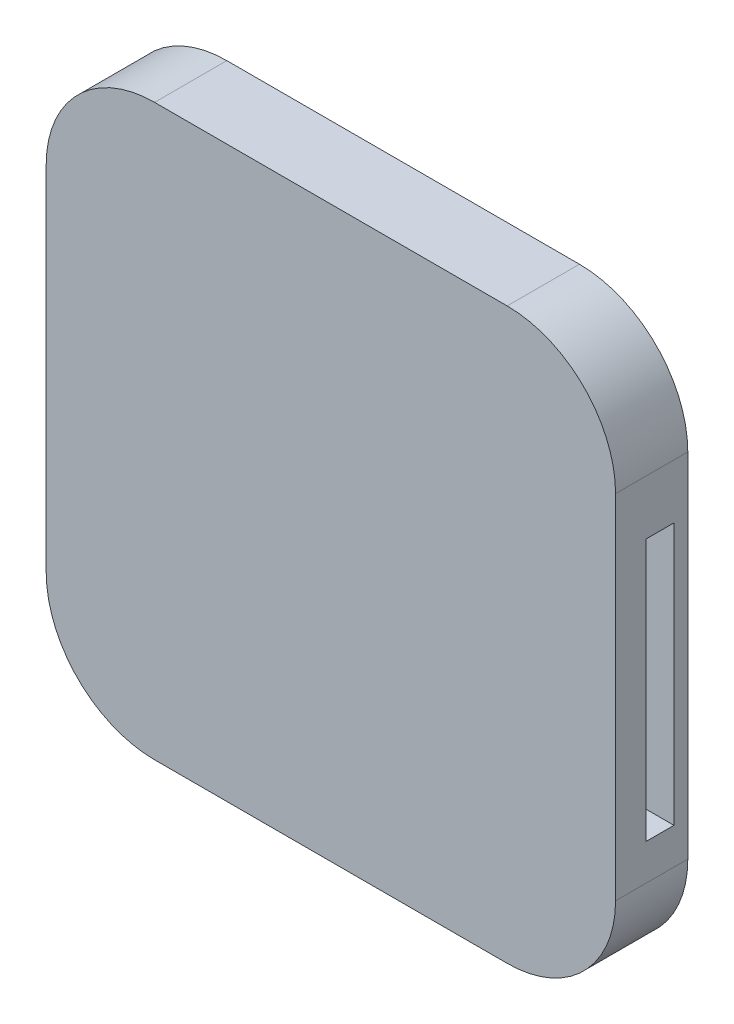
ISO-10303-21;
HEADER;
FILE_DESCRIPTION(('STEP AP214'),'2;1');
FILE_NAME('part.step','',(''),(''),'','','');
FILE_SCHEMA(('AUTOMOTIVE_DESIGN { 1 0 10303 214 1 1 1 1 }'));
ENDSEC;
DATA;
#1=APPLICATION_CONTEXT('core data for automotive mechanical design processes');
#2=APPLICATION_PROTOCOL_DEFINITION('international standard','automotive_design',2000,#1);
#3=PRODUCT_CONTEXT('',#1,'mechanical');
#4=PRODUCT('Part','Part','',(#3));
#5=PRODUCT_RELATED_PRODUCT_CATEGORY('part','',(#4));
#6=PRODUCT_DEFINITION_FORMATION('','',#4);
#7=PRODUCT_DEFINITION_CONTEXT('part definition',#1,'design');
#8=PRODUCT_DEFINITION('design','',#6,#7);
#9=PRODUCT_DEFINITION_SHAPE('','',#8);
#10=(LENGTH_UNIT() NAMED_UNIT(*) SI_UNIT(.MILLI.,.METRE.));
#11=(NAMED_UNIT(*) PLANE_ANGLE_UNIT() SI_UNIT($,.RADIAN.));
#12=(NAMED_UNIT(*) SI_UNIT($,.STERADIAN.) SOLID_ANGLE_UNIT());
#13=UNCERTAINTY_MEASURE_WITH_UNIT(LENGTH_MEASURE(1.E-05),#10,'distance_accuracy_value','');
#14=(GEOMETRIC_REPRESENTATION_CONTEXT(3) GLOBAL_UNCERTAINTY_ASSIGNED_CONTEXT((#13)) GLOBAL_UNIT_ASSIGNED_CONTEXT((#10,
#11,#12)) REPRESENTATION_CONTEXT('',''));
#15=CARTESIAN_POINT('',(0.,0.,0.));
#16=DIRECTION('',(0.,0.,1.));
#17=DIRECTION('',(1.,0.,0.));
#18=AXIS2_PLACEMENT_3D('',#15,#16,#17);
#19=CARTESIAN_POINT('',(-29.1727335907336,34.1958532818533,12.7));
#20=DIRECTION('',(1.,0.,0.));
#21=DIRECTION('',(0.,1.,0.));
#22=AXIS2_PLACEMENT_3D('',#19,#20,#21);
#23=PLANE('',#22);
#24=DIRECTION('',(0.,-1.,0.));
#25=VECTOR('',#24,1.);
#26=CARTESIAN_POINT('',(-29.1727335907336,34.1958532818533,0.));
#27=LINE('',#26,#25);
#28=CARTESIAN_POINT('',(-29.1727335907336,15.1458532818533,0.));
#29=VERTEX_POINT('',#28);
#30=CARTESIAN_POINT('',(-29.1727335907336,-46.8301467181467,0.));
#31=VERTEX_POINT('',#30);
#32=EDGE_CURVE('E158',#29,#31,#27,.T.);
#33=ORIENTED_EDGE('',*,*,#32,.T.);
#34=DIRECTION('',(0.,0.,-1.));
#35=VECTOR('',#34,1.);
#36=CARTESIAN_POINT('',(-29.1727335907336,-46.8301467181467,12.7));
#37=LINE('',#36,#35);
#38=CARTESIAN_POINT('',(-29.1727335907336,-46.8301467181467,12.7));
#39=VERTEX_POINT('',#38);
#40=EDGE_CURVE('E212',#31,#39,#37,.F.);
#41=ORIENTED_EDGE('',*,*,#40,.T.);
#42=DIRECTION('',(0.,-1.,0.));
#43=VECTOR('',#42,1.);
#44=CARTESIAN_POINT('',(-29.1727335907336,34.1958532818533,12.7));
#45=LINE('',#44,#43);
#46=CARTESIAN_POINT('',(-29.1727335907336,15.1458532818533,12.7));
#47=VERTEX_POINT('',#46);
#48=EDGE_CURVE('E162',#47,#39,#45,.T.);
#49=ORIENTED_EDGE('',*,*,#48,.F.);
#50=DIRECTION('',(0.,0.,-1.));
#51=VECTOR('',#50,1.);
#52=CARTESIAN_POINT('',(-29.1727335907336,15.1458532818533,12.7));
#53=LINE('',#52,#51);
#54=EDGE_CURVE('E209',#47,#29,#53,.T.);
#55=ORIENTED_EDGE('',*,*,#54,.T.);
#56=EDGE_LOOP('',(#33,#41,#49,#55));
#57=FACE_BOUND('',#56,.T.);
#58=ADVANCED_FACE('F33',(#57),#23,.F.);
#59=CARTESIAN_POINT('',(-29.1727335907336,-65.8801467181467,12.7));
#60=DIRECTION('',(0.,1.,0.));
#61=DIRECTION('',(0.,0.,1.));
#62=AXIS2_PLACEMENT_3D('',#59,#60,#61);
#63=PLANE('',#62);
#64=DIRECTION('',(1.,0.,0.));
#65=VECTOR('',#64,1.);
#66=CARTESIAN_POINT('',(-29.1727335907336,-65.8801467181467,0.));
#67=LINE('',#66,#65);
#68=CARTESIAN_POINT('',(-10.1227335907336,-65.8801467181467,0.));
#69=VERTEX_POINT('',#68);
#70=CARTESIAN_POINT('',(51.8532664092664,-65.8801467181467,0.));
#71=VERTEX_POINT('',#70);
#72=EDGE_CURVE('E177',#69,#71,#67,.T.);
#73=ORIENTED_EDGE('',*,*,#72,.T.);
#74=DIRECTION('',(0.,0.,-1.));
#75=VECTOR('',#74,1.);
#76=CARTESIAN_POINT('',(51.8532664092664,-65.8801467181467,12.7));
#77=LINE('',#76,#75);
#78=CARTESIAN_POINT('',(51.8532664092664,-65.8801467181467,12.7));
#79=VERTEX_POINT('',#78);
#80=EDGE_CURVE('E199',#71,#79,#77,.F.);
#81=ORIENTED_EDGE('',*,*,#80,.T.);
#82=DIRECTION('',(1.,0.,0.));
#83=VECTOR('',#82,1.);
#84=CARTESIAN_POINT('',(-29.1727335907336,-65.8801467181467,12.7));
#85=LINE('',#84,#83);
#86=CARTESIAN_POINT('',(-10.1227335907336,-65.8801467181467,12.7));
#87=VERTEX_POINT('',#86);
#88=EDGE_CURVE('E165',#87,#79,#85,.T.);
#89=ORIENTED_EDGE('',*,*,#88,.F.);
#90=DIRECTION('',(0.,0.,-1.));
#91=VECTOR('',#90,1.);
#92=CARTESIAN_POINT('',(-10.1227335907336,-65.8801467181467,12.7));
#93=LINE('',#92,#91);
#94=EDGE_CURVE('E196',#87,#69,#93,.T.);
#95=ORIENTED_EDGE('',*,*,#94,.T.);
#96=EDGE_LOOP('',(#73,#81,#89,#95));
#97=FACE_BOUND('',#96,.T.);
#98=ADVANCED_FACE('F228',(#97),#63,.F.);
#99=CARTESIAN_POINT('',(70.9032664092664,34.1958532818533,12.7));
#100=DIRECTION('',(-1.,0.,0.));
#101=DIRECTION('',(0.,0.,1.));
#102=AXIS2_PLACEMENT_3D('',#99,#100,#101);
#103=PLANE('',#102);
#104=DIRECTION('',(0.,0.,-1.));
#105=VECTOR('',#104,1.);
#106=CARTESIAN_POINT('',(70.9032664092664,-40.4756229609282,7.3811634504968));
#107=LINE('',#106,#105);
#108=CARTESIAN_POINT('',(70.9032664092664,-40.4756229609282,7.3811634504968));
#109=VERTEX_POINT('',#108);
#110=CARTESIAN_POINT('',(70.9032664092664,-40.4756229609282,2.43295424888998));
#111=VERTEX_POINT('',#110);
#112=EDGE_CURVE('E152',#109,#111,#107,.T.);
#113=ORIENTED_EDGE('',*,*,#112,.F.);
#114=DIRECTION('',(0.,-1.,0.));
#115=VECTOR('',#114,1.);
#116=CARTESIAN_POINT('',(70.9032664092664,5.56423656706574,7.3811634504968));
#117=LINE('',#116,#115);
#118=CARTESIAN_POINT('',(70.9032664092664,5.56423656706574,7.3811634504968));
#119=VERTEX_POINT('',#118);
#120=EDGE_CURVE('E48',#119,#109,#117,.T.);
#121=ORIENTED_EDGE('',*,*,#120,.F.);
#122=DIRECTION('',(0.,0.,1.));
#123=VECTOR('',#122,1.);
#124=CARTESIAN_POINT('',(70.9032664092664,5.56423656706574,7.3811634504968));
#125=LINE('',#124,#123);
#126=CARTESIAN_POINT('',(70.9032664092664,5.56423656706574,2.43295424888998));
#127=VERTEX_POINT('',#126);
#128=EDGE_CURVE('E143',#127,#119,#125,.T.);
#129=ORIENTED_EDGE('',*,*,#128,.F.);
#130=DIRECTION('',(0.,1.,0.));
#131=VECTOR('',#130,1.);
#132=CARTESIAN_POINT('',(70.9032664092664,5.56423656706574,2.43295424888998));
#133=LINE('',#132,#131);
#134=EDGE_CURVE('E146',#111,#127,#133,.T.);
#135=ORIENTED_EDGE('',*,*,#134,.F.);
#136=EDGE_LOOP('',(#113,#121,#129,#135));
#137=FACE_BOUND('',#136,.T.);
#138=DIRECTION('',(0.,1.,0.));
#139=VECTOR('',#138,1.);
#140=CARTESIAN_POINT('',(70.9032664092664,34.1958532818533,12.7));
#141=LINE('',#140,#139);
#142=CARTESIAN_POINT('',(70.9032664092664,-46.8301467181467,12.7));
#143=VERTEX_POINT('',#142);
#144=CARTESIAN_POINT('',(70.9032664092664,15.1458532818533,12.7));
#145=VERTEX_POINT('',#144);
#146=EDGE_CURVE('E169',#143,#145,#141,.T.);
#147=ORIENTED_EDGE('',*,*,#146,.F.);
#148=DIRECTION('',(0.,0.,-1.));
#149=VECTOR('',#148,1.);
#150=CARTESIAN_POINT('',(70.9032664092664,-46.8301467181467,12.7));
#151=LINE('',#150,#149);
#152=CARTESIAN_POINT('',(70.9032664092664,-46.8301467181467,0.));
#153=VERTEX_POINT('',#152);
#154=EDGE_CURVE('E185',#143,#153,#151,.T.);
#155=ORIENTED_EDGE('',*,*,#154,.T.);
#156=DIRECTION('',(0.,1.,0.));
#157=VECTOR('',#156,1.);
#158=CARTESIAN_POINT('',(70.9032664092664,34.1958532818533,0.));
#159=LINE('',#158,#157);
#160=CARTESIAN_POINT('',(70.9032664092664,15.1458532818533,0.));
#161=VERTEX_POINT('',#160);
#162=EDGE_CURVE('E180',#153,#161,#159,.T.);
#163=ORIENTED_EDGE('',*,*,#162,.T.);
#164=DIRECTION('',(0.,0.,-1.));
#165=VECTOR('',#164,1.);
#166=CARTESIAN_POINT('',(70.9032664092664,15.1458532818533,12.7));
#167=LINE('',#166,#165);
#168=EDGE_CURVE('E174',#161,#145,#167,.F.);
#169=ORIENTED_EDGE('',*,*,#168,.T.);
#170=EDGE_LOOP('',(#147,#155,#163,#169));
#171=FACE_BOUND('',#170,.T.);
#172=ADVANCED_FACE('F239',(#137,#171),#103,.F.);
#173=CARTESIAN_POINT('',(-29.1727335907336,34.1958532818533,12.7));
#174=DIRECTION('',(0.,-1.,0.));
#175=DIRECTION('',(0.,0.,-1.));
#176=AXIS2_PLACEMENT_3D('',#173,#174,#175);
#177=PLANE('',#176);
#178=DIRECTION('',(-1.,0.,0.));
#179=VECTOR('',#178,1.);
#180=CARTESIAN_POINT('',(-29.1727335907336,34.1958532818533,12.7));
#181=LINE('',#180,#179);
#182=CARTESIAN_POINT('',(51.8532664092664,34.1958532818533,12.7));
#183=VERTEX_POINT('',#182);
#184=CARTESIAN_POINT('',(-10.1227335907336,34.1958532818533,12.7));
#185=VERTEX_POINT('',#184);
#186=EDGE_CURVE('E172',#183,#185,#181,.T.);
#187=ORIENTED_EDGE('',*,*,#186,.F.);
#188=DIRECTION('',(0.,0.,-1.));
#189=VECTOR('',#188,1.);
#190=CARTESIAN_POINT('',(51.8532664092664,34.1958532818533,12.7));
#191=LINE('',#190,#189);
#192=CARTESIAN_POINT('',(51.8532664092664,34.1958532818533,0.));
#193=VERTEX_POINT('',#192);
#194=EDGE_CURVE('E11',#183,#193,#191,.T.);
#195=ORIENTED_EDGE('',*,*,#194,.T.);
#196=DIRECTION('',(-1.,0.,0.));
#197=VECTOR('',#196,1.);
#198=CARTESIAN_POINT('',(-29.1727335907336,34.1958532818533,0.));
#199=LINE('',#198,#197);
#200=CARTESIAN_POINT('',(-10.1227335907336,34.1958532818533,0.));
#201=VERTEX_POINT('',#200);
#202=EDGE_CURVE('E166',#193,#201,#199,.T.);
#203=ORIENTED_EDGE('',*,*,#202,.T.);
#204=DIRECTION('',(0.,0.,-1.));
#205=VECTOR('',#204,1.);
#206=CARTESIAN_POINT('',(-10.1227335907336,34.1958532818533,12.7));
#207=LINE('',#206,#205);
#208=EDGE_CURVE('E41',#201,#185,#207,.F.);
#209=ORIENTED_EDGE('',*,*,#208,.T.);
#210=EDGE_LOOP('',(#187,#195,#203,#209));
#211=FACE_BOUND('',#210,.T.);
#212=ADVANCED_FACE('F246',(#211),#177,.F.);
#213=CARTESIAN_POINT('',(0.,0.,12.7));
#214=DIRECTION('',(0.,0.,1.));
#215=DIRECTION('',(1.,0.,0.));
#216=AXIS2_PLACEMENT_3D('',#213,#214,#215);
#217=PLANE('',#216);
#218=ORIENTED_EDGE('',*,*,#88,.T.);
#219=CARTESIAN_POINT('',(51.8532664092664,-46.8301467181467,12.7));
#220=DIRECTION('',(0.,0.,1.));
#221=DIRECTION('',(1.,0.,0.));
#222=AXIS2_PLACEMENT_3D('',#219,#220,#221);
#223=CIRCLE('',#222,19.05);
#224=EDGE_CURVE('E207',#79,#143,#223,.T.);
#225=ORIENTED_EDGE('',*,*,#224,.T.);
#226=ORIENTED_EDGE('',*,*,#146,.T.);
#227=CARTESIAN_POINT('',(51.8532664092664,15.1458532818533,12.7));
#228=DIRECTION('',(0.,0.,1.));
#229=DIRECTION('',(1.,0.,0.));
#230=AXIS2_PLACEMENT_3D('',#227,#228,#229);
#231=CIRCLE('',#230,19.05);
#232=EDGE_CURVE('E203',#145,#183,#231,.T.);
#233=ORIENTED_EDGE('',*,*,#232,.T.);
#234=ORIENTED_EDGE('',*,*,#186,.T.);
#235=CARTESIAN_POINT('',(-10.1227335907336,15.1458532818533,12.7));
#236=DIRECTION('',(0.,0.,1.));
#237=DIRECTION('',(1.,0.,0.));
#238=AXIS2_PLACEMENT_3D('',#235,#236,#237);
#239=CIRCLE('',#238,19.05);
#240=EDGE_CURVE('E201',#185,#47,#239,.T.);
#241=ORIENTED_EDGE('',*,*,#240,.T.);
#242=ORIENTED_EDGE('',*,*,#48,.T.);
#243=CARTESIAN_POINT('',(-10.1227335907336,-46.8301467181467,12.7));
#244=DIRECTION('',(0.,0.,1.));
#245=DIRECTION('',(1.,0.,0.));
#246=AXIS2_PLACEMENT_3D('',#243,#244,#245);
#247=CIRCLE('',#246,19.05);
#248=EDGE_CURVE('E205',#39,#87,#247,.T.);
#249=ORIENTED_EDGE('',*,*,#248,.T.);
#250=EDGE_LOOP('',(#218,#225,#226,#233,#234,#241,#242,#249));
#251=FACE_BOUND('',#250,.T.);
#252=ADVANCED_FACE('F221',(#251),#217,.T.);
#253=CARTESIAN_POINT('',(0.,0.,0.));
#254=DIRECTION('',(0.,0.,1.));
#255=DIRECTION('',(1.,0.,0.));
#256=AXIS2_PLACEMENT_3D('',#253,#254,#255);
#257=PLANE('',#256);
#258=ORIENTED_EDGE('',*,*,#162,.F.);
#259=CARTESIAN_POINT('',(51.8532664092664,-46.8301467181467,0.));
#260=DIRECTION('',(0.,0.,1.));
#261=DIRECTION('',(1.,0.,0.));
#262=AXIS2_PLACEMENT_3D('',#259,#260,#261);
#263=CIRCLE('',#262,19.05);
#264=EDGE_CURVE('E194',#153,#71,#263,.F.);
#265=ORIENTED_EDGE('',*,*,#264,.T.);
#266=ORIENTED_EDGE('',*,*,#72,.F.);
#267=CARTESIAN_POINT('',(-10.1227335907336,-46.8301467181467,0.));
#268=DIRECTION('',(0.,0.,1.));
#269=DIRECTION('',(1.,0.,0.));
#270=AXIS2_PLACEMENT_3D('',#267,#268,#269);
#271=CIRCLE('',#270,19.05);
#272=EDGE_CURVE('E192',#69,#31,#271,.F.);
#273=ORIENTED_EDGE('',*,*,#272,.T.);
#274=ORIENTED_EDGE('',*,*,#32,.F.);
#275=CARTESIAN_POINT('',(-10.1227335907336,15.1458532818533,0.));
#276=DIRECTION('',(0.,0.,1.));
#277=DIRECTION('',(1.,0.,0.));
#278=AXIS2_PLACEMENT_3D('',#275,#276,#277);
#279=CIRCLE('',#278,19.05);
#280=EDGE_CURVE('E188',#29,#201,#279,.F.);
#281=ORIENTED_EDGE('',*,*,#280,.T.);
#282=ORIENTED_EDGE('',*,*,#202,.F.);
#283=CARTESIAN_POINT('',(51.8532664092664,15.1458532818533,0.));
#284=DIRECTION('',(0.,0.,1.));
#285=DIRECTION('',(1.,0.,0.));
#286=AXIS2_PLACEMENT_3D('',#283,#284,#285);
#287=CIRCLE('',#286,19.05);
#288=EDGE_CURVE('E190',#193,#161,#287,.F.);
#289=ORIENTED_EDGE('',*,*,#288,.T.);
#290=EDGE_LOOP('',(#258,#265,#266,#273,#274,#281,#282,#289));
#291=FACE_BOUND('',#290,.T.);
#292=ADVANCED_FACE('F232',(#291),#257,.F.);
#293=CARTESIAN_POINT('',(51.8532664092664,-46.8301467181467,12.7));
#294=DIRECTION('',(0.,0.,-1.));
#295=DIRECTION('',(-1.,0.,0.));
#296=AXIS2_PLACEMENT_3D('',#293,#294,#295);
#297=CYLINDRICAL_SURFACE('',#296,19.05);
#298=ORIENTED_EDGE('',*,*,#224,.F.);
#299=ORIENTED_EDGE('',*,*,#80,.F.);
#300=ORIENTED_EDGE('',*,*,#264,.F.);
#301=ORIENTED_EDGE('',*,*,#154,.F.);
#302=EDGE_LOOP('',(#298,#299,#300,#301));
#303=FACE_BOUND('',#302,.T.);
#304=ADVANCED_FACE('F236',(#303),#297,.T.);
#305=CARTESIAN_POINT('',(-10.1227335907336,-46.8301467181467,12.7));
#306=DIRECTION('',(0.,0.,-1.));
#307=DIRECTION('',(-1.,0.,0.));
#308=AXIS2_PLACEMENT_3D('',#305,#306,#307);
#309=CYLINDRICAL_SURFACE('',#308,19.05);
#310=ORIENTED_EDGE('',*,*,#248,.F.);
#311=ORIENTED_EDGE('',*,*,#40,.F.);
#312=ORIENTED_EDGE('',*,*,#272,.F.);
#313=ORIENTED_EDGE('',*,*,#94,.F.);
#314=EDGE_LOOP('',(#310,#311,#312,#313));
#315=FACE_BOUND('',#314,.T.);
#316=ADVANCED_FACE('F225',(#315),#309,.T.);
#317=CARTESIAN_POINT('',(51.8532664092664,15.1458532818533,12.7));
#318=DIRECTION('',(0.,0.,-1.));
#319=DIRECTION('',(-1.,0.,0.));
#320=AXIS2_PLACEMENT_3D('',#317,#318,#319);
#321=CYLINDRICAL_SURFACE('',#320,19.05);
#322=ORIENTED_EDGE('',*,*,#232,.F.);
#323=ORIENTED_EDGE('',*,*,#168,.F.);
#324=ORIENTED_EDGE('',*,*,#288,.F.);
#325=ORIENTED_EDGE('',*,*,#194,.F.);
#326=EDGE_LOOP('',(#322,#323,#324,#325));
#327=FACE_BOUND('',#326,.T.);
#328=ADVANCED_FACE('F244',(#327),#321,.T.);
#329=CARTESIAN_POINT('',(-10.1227335907336,15.1458532818533,12.7));
#330=DIRECTION('',(0.,0.,-1.));
#331=DIRECTION('',(-1.,0.,0.));
#332=AXIS2_PLACEMENT_3D('',#329,#330,#331);
#333=CYLINDRICAL_SURFACE('',#332,19.05);
#334=ORIENTED_EDGE('',*,*,#240,.F.);
#335=ORIENTED_EDGE('',*,*,#208,.F.);
#336=ORIENTED_EDGE('',*,*,#280,.F.);
#337=ORIENTED_EDGE('',*,*,#54,.F.);
#338=EDGE_LOOP('',(#334,#335,#336,#337));
#339=FACE_BOUND('',#338,.T.);
#340=ADVANCED_FACE('F35',(#339),#333,.T.);
#341=CARTESIAN_POINT('',(60.9972664092664,5.56423656706574,7.3811634504968));
#342=DIRECTION('',(0.,0.,1.));
#343=DIRECTION('',(1.,0.,0.));
#344=AXIS2_PLACEMENT_3D('',#341,#342,#343);
#345=PLANE('',#344);
#346=ORIENTED_EDGE('',*,*,#120,.T.);
#347=DIRECTION('',(1.,0.,0.));
#348=VECTOR('',#347,1.);
#349=CARTESIAN_POINT('',(60.9972664092664,-40.4756229609282,7.3811634504968));
#350=LINE('',#349,#348);
#351=CARTESIAN_POINT('',(60.9972664092664,-40.4756229609282,7.3811634504968));
#352=VERTEX_POINT('',#351);
#353=EDGE_CURVE('E121',#352,#109,#350,.T.);
#354=ORIENTED_EDGE('',*,*,#353,.F.);
#355=DIRECTION('',(0.,-1.,0.));
#356=VECTOR('',#355,1.);
#357=CARTESIAN_POINT('',(60.9972664092664,5.56423656706574,7.3811634504968));
#358=LINE('',#357,#356);
#359=CARTESIAN_POINT('',(60.9972664092664,5.56423656706574,7.3811634504968));
#360=VERTEX_POINT('',#359);
#361=EDGE_CURVE('E125',#360,#352,#358,.T.);
#362=ORIENTED_EDGE('',*,*,#361,.F.);
#363=DIRECTION('',(1.,0.,0.));
#364=VECTOR('',#363,1.);
#365=CARTESIAN_POINT('',(60.9972664092664,5.56423656706574,7.3811634504968));
#366=LINE('',#365,#364);
#367=EDGE_CURVE('E156',#360,#119,#366,.T.);
#368=ORIENTED_EDGE('',*,*,#367,.T.);
#369=EDGE_LOOP('',(#346,#354,#362,#368));
#370=FACE_BOUND('',#369,.T.);
#371=ADVANCED_FACE('F123',(#370),#345,.F.);
#372=CARTESIAN_POINT('',(60.9972664092664,5.56423656706574,7.3811634504968));
#373=DIRECTION('',(0.,1.,0.));
#374=DIRECTION('',(0.,0.,1.));
#375=AXIS2_PLACEMENT_3D('',#372,#373,#374);
#376=PLANE('',#375);
#377=ORIENTED_EDGE('',*,*,#128,.T.);
#378=ORIENTED_EDGE('',*,*,#367,.F.);
#379=DIRECTION('',(0.,0.,1.));
#380=VECTOR('',#379,1.);
#381=CARTESIAN_POINT('',(60.9972664092664,5.56423656706574,7.3811634504968));
#382=LINE('',#381,#380);
#383=CARTESIAN_POINT('',(60.9972664092664,5.56423656706574,2.43295424888998));
#384=VERTEX_POINT('',#383);
#385=EDGE_CURVE('E131',#384,#360,#382,.T.);
#386=ORIENTED_EDGE('',*,*,#385,.F.);
#387=DIRECTION('',(1.,0.,0.));
#388=VECTOR('',#387,1.);
#389=CARTESIAN_POINT('',(60.9972664092664,5.56423656706574,2.43295424888998));
#390=LINE('',#389,#388);
#391=EDGE_CURVE('E159',#384,#127,#390,.T.);
#392=ORIENTED_EDGE('',*,*,#391,.T.);
#393=EDGE_LOOP('',(#377,#378,#386,#392));
#394=FACE_BOUND('',#393,.T.);
#395=ADVANCED_FACE('F253',(#394),#376,.F.);
#396=CARTESIAN_POINT('',(60.9972664092664,5.56423656706574,2.43295424888998));
#397=DIRECTION('',(0.,0.,-1.));
#398=DIRECTION('',(-1.,0.,0.));
#399=AXIS2_PLACEMENT_3D('',#396,#397,#398);
#400=PLANE('',#399);
#401=ORIENTED_EDGE('',*,*,#134,.T.);
#402=ORIENTED_EDGE('',*,*,#391,.F.);
#403=DIRECTION('',(0.,1.,0.));
#404=VECTOR('',#403,1.);
#405=CARTESIAN_POINT('',(60.9972664092664,5.56423656706574,2.43295424888998));
#406=LINE('',#405,#404);
#407=CARTESIAN_POINT('',(60.9972664092664,-40.4756229609282,2.43295424888998));
#408=VERTEX_POINT('',#407);
#409=EDGE_CURVE('E139',#408,#384,#406,.T.);
#410=ORIENTED_EDGE('',*,*,#409,.F.);
#411=DIRECTION('',(1.,0.,0.));
#412=VECTOR('',#411,1.);
#413=CARTESIAN_POINT('',(60.9972664092664,-40.4756229609282,2.43295424888998));
#414=LINE('',#413,#412);
#415=EDGE_CURVE('E130',#408,#111,#414,.T.);
#416=ORIENTED_EDGE('',*,*,#415,.T.);
#417=EDGE_LOOP('',(#401,#402,#410,#416));
#418=FACE_BOUND('',#417,.T.);
#419=ADVANCED_FACE('F305',(#418),#400,.F.);
#420=CARTESIAN_POINT('',(60.9972664092664,-40.4756229609282,7.3811634504968));
#421=DIRECTION('',(0.,-1.,0.));
#422=DIRECTION('',(0.,0.,-1.));
#423=AXIS2_PLACEMENT_3D('',#420,#421,#422);
#424=PLANE('',#423);
#425=ORIENTED_EDGE('',*,*,#112,.T.);
#426=ORIENTED_EDGE('',*,*,#415,.F.);
#427=DIRECTION('',(0.,0.,-1.));
#428=VECTOR('',#427,1.);
#429=CARTESIAN_POINT('',(60.9972664092664,-40.4756229609282,7.3811634504968));
#430=LINE('',#429,#428);
#431=EDGE_CURVE('E134',#352,#408,#430,.T.);
#432=ORIENTED_EDGE('',*,*,#431,.F.);
#433=ORIENTED_EDGE('',*,*,#353,.T.);
#434=EDGE_LOOP('',(#425,#426,#432,#433));
#435=FACE_BOUND('',#434,.T.);
#436=ADVANCED_FACE('F135',(#435),#424,.F.);
#437=CARTESIAN_POINT('',(60.9972664092664,0.,0.));
#438=DIRECTION('',(1.,0.,0.));
#439=DIRECTION('',(0.,0.,-1.));
#440=AXIS2_PLACEMENT_3D('',#437,#438,#439);
#441=PLANE('',#440);
#442=ORIENTED_EDGE('',*,*,#361,.T.);
#443=ORIENTED_EDGE('',*,*,#431,.T.);
#444=ORIENTED_EDGE('',*,*,#409,.T.);
#445=ORIENTED_EDGE('',*,*,#385,.T.);
#446=EDGE_LOOP('',(#442,#443,#444,#445));
#447=FACE_BOUND('',#446,.T.);
#448=ADVANCED_FACE('F141',(#447),#441,.T.);
#449=CLOSED_SHELL('',(#58,#98,#172,#212,#252,#292,#304,#316,#328,#340,#371,#395,#419,#436,#448));
#450=MANIFOLD_SOLID_BREP('B2',#449);
#451=ADVANCED_BREP_SHAPE_REPRESENTATION('',(#18,#450),#14);
#452=SHAPE_DEFINITION_REPRESENTATION(#9,#451);
ENDSEC;
END-ISO-10303-21;
